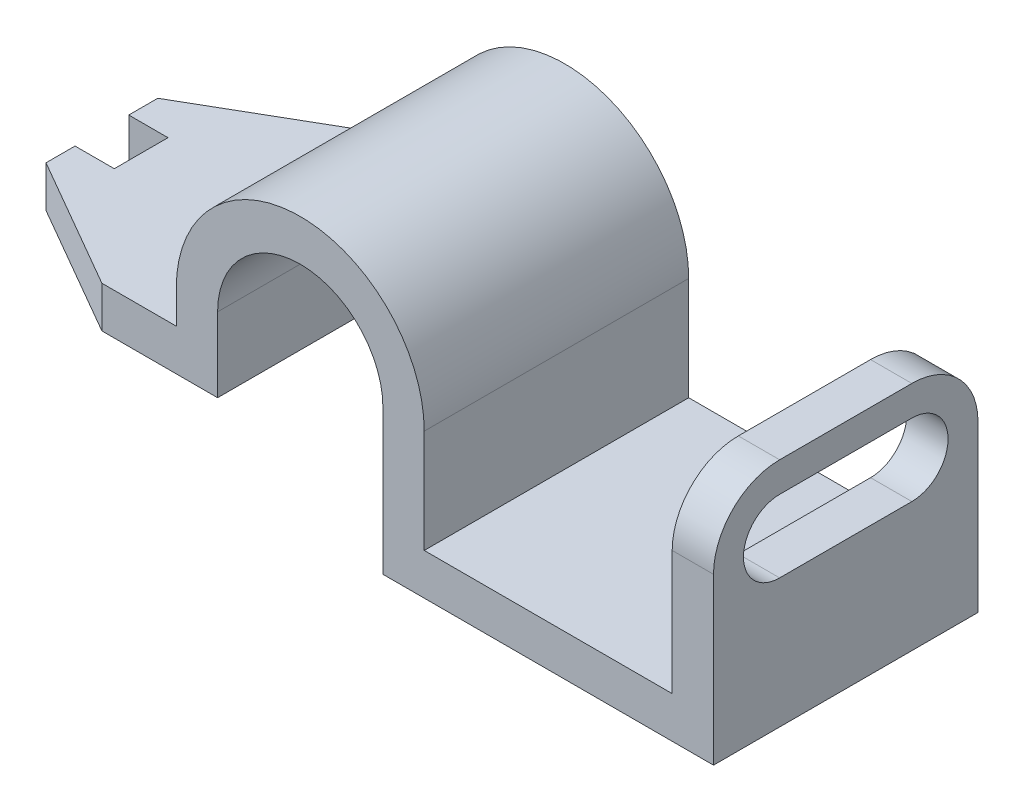
ISO-10303-21;
HEADER;
FILE_DESCRIPTION(('STEP AP214'),'2;1');
FILE_NAME('part.step','',(''),(''),'','','');
FILE_SCHEMA(('AUTOMOTIVE_DESIGN { 1 0 10303 214 1 1 1 1 }'));
ENDSEC;
DATA;
#1=APPLICATION_CONTEXT('core data for automotive mechanical design processes');
#2=APPLICATION_PROTOCOL_DEFINITION('international standard','automotive_design',2000,#1);
#3=PRODUCT_CONTEXT('',#1,'mechanical');
#4=PRODUCT('Part','Part','',(#3));
#5=PRODUCT_RELATED_PRODUCT_CATEGORY('part','',(#4));
#6=PRODUCT_DEFINITION_FORMATION('','',#4);
#7=PRODUCT_DEFINITION_CONTEXT('part definition',#1,'design');
#8=PRODUCT_DEFINITION('design','',#6,#7);
#9=PRODUCT_DEFINITION_SHAPE('','',#8);
#10=(LENGTH_UNIT() NAMED_UNIT(*) SI_UNIT(.MILLI.,.METRE.));
#11=(NAMED_UNIT(*) PLANE_ANGLE_UNIT() SI_UNIT($,.RADIAN.));
#12=(NAMED_UNIT(*) SI_UNIT($,.STERADIAN.) SOLID_ANGLE_UNIT());
#13=UNCERTAINTY_MEASURE_WITH_UNIT(LENGTH_MEASURE(1.E-05),#10,'distance_accuracy_value','');
#14=(GEOMETRIC_REPRESENTATION_CONTEXT(3) GLOBAL_UNCERTAINTY_ASSIGNED_CONTEXT((#13)) GLOBAL_UNIT_ASSIGNED_CONTEXT((#10,
#11,#12)) REPRESENTATION_CONTEXT('',''));
#15=CARTESIAN_POINT('',(0.,0.,0.));
#16=DIRECTION('',(0.,0.,1.));
#17=DIRECTION('',(1.,0.,0.));
#18=AXIS2_PLACEMENT_3D('',#15,#16,#17);
#19=CARTESIAN_POINT('',(-100.,27.,32.));
#20=DIRECTION('',(1.,0.,0.));
#21=DIRECTION('',(0.,0.,-1.));
#22=AXIS2_PLACEMENT_3D('',#19,#20,#21);
#23=PLANE('',#22);
#24=DIRECTION('',(0.,0.,-1.));
#25=VECTOR('',#24,1.);
#26=CARTESIAN_POINT('',(-100.,27.,32.));
#27=LINE('',#26,#25);
#28=CARTESIAN_POINT('',(-100.,27.,-6.5));
#29=VERTEX_POINT('',#28);
#30=CARTESIAN_POINT('',(-100.,27.,-13.5247913859322));
#31=VERTEX_POINT('',#30);
#32=EDGE_CURVE('E384',#29,#31,#27,.T.);
#33=ORIENTED_EDGE('',*,*,#32,.T.);
#34=DIRECTION('',(0.,1.,0.));
#35=VECTOR('',#34,1.);
#36=CARTESIAN_POINT('',(-100.,-0.001000000000001,-13.5247913859322));
#37=LINE('',#36,#35);
#38=CARTESIAN_POINT('',(-100.,17.,-13.5247913859322));
#39=VERTEX_POINT('',#38);
#40=EDGE_CURVE('E255',#39,#31,#37,.T.);
#41=ORIENTED_EDGE('',*,*,#40,.F.);
#42=DIRECTION('',(0.,0.,-1.));
#43=VECTOR('',#42,1.);
#44=CARTESIAN_POINT('',(-100.,17.,32.));
#45=LINE('',#44,#43);
#46=CARTESIAN_POINT('',(-100.,17.,-6.5));
#47=VERTEX_POINT('',#46);
#48=EDGE_CURVE('E380',#47,#39,#45,.T.);
#49=ORIENTED_EDGE('',*,*,#48,.F.);
#50=DIRECTION('',(0.,1.,0.));
#51=VECTOR('',#50,1.);
#52=CARTESIAN_POINT('',(-100.,-0.001000000000001,-6.5));
#53=LINE('',#52,#51);
#54=EDGE_CURVE('E266',#47,#29,#53,.T.);
#55=ORIENTED_EDGE('',*,*,#54,.T.);
#56=EDGE_LOOP('',(#33,#41,#49,#55));
#57=FACE_BOUND('',#56,.T.);
#58=ADVANCED_FACE('F41',(#57),#23,.F.);
#59=CARTESIAN_POINT('',(-100.,27.,32.));
#60=DIRECTION('',(0.,-1.,0.));
#61=DIRECTION('',(0.,0.,-1.));
#62=AXIS2_PLACEMENT_3D('',#59,#60,#61);
#63=PLANE('',#62);
#64=DIRECTION('',(-1.,0.,0.));
#65=VECTOR('',#64,1.);
#66=CARTESIAN_POINT('',(-100.,27.,-32.));
#67=LINE('',#66,#65);
#68=CARTESIAN_POINT('',(-50.,27.,-32.));
#69=VERTEX_POINT('',#68);
#70=CARTESIAN_POINT('',(-68.,27.,-32.));
#71=VERTEX_POINT('',#70);
#72=EDGE_CURVE('E263',#69,#71,#67,.T.);
#73=ORIENTED_EDGE('',*,*,#72,.T.);
#74=DIRECTION('',(0.866025403784442,0.,-0.499999999999995));
#75=VECTOR('',#74,1.);
#76=CARTESIAN_POINT('',(-100.,27.,-13.5247913859322));
#77=LINE('',#76,#75);
#78=EDGE_CURVE('E253',#31,#71,#77,.T.);
#79=ORIENTED_EDGE('',*,*,#78,.F.);
#80=ORIENTED_EDGE('',*,*,#32,.F.);
#81=DIRECTION('',(-1.,0.,0.));
#82=VECTOR('',#81,1.);
#83=CARTESIAN_POINT('',(-100.,27.,-6.5));
#84=LINE('',#83,#82);
#85=CARTESIAN_POINT('',(-90.5,27.,-6.5));
#86=VERTEX_POINT('',#85);
#87=EDGE_CURVE('E270',#86,#29,#84,.T.);
#88=ORIENTED_EDGE('',*,*,#87,.F.);
#89=DIRECTION('',(0.,0.,-1.));
#90=VECTOR('',#89,1.);
#91=CARTESIAN_POINT('',(-90.5,27.,-6.5));
#92=LINE('',#91,#90);
#93=CARTESIAN_POINT('',(-90.5,27.,6.5));
#94=VERTEX_POINT('',#93);
#95=EDGE_CURVE('E278',#94,#86,#92,.T.);
#96=ORIENTED_EDGE('',*,*,#95,.F.);
#97=DIRECTION('',(1.,0.,0.));
#98=VECTOR('',#97,1.);
#99=CARTESIAN_POINT('',(-100.,27.,6.5));
#100=LINE('',#99,#98);
#101=CARTESIAN_POINT('',(-100.,27.,6.5));
#102=VERTEX_POINT('',#101);
#103=EDGE_CURVE('E281',#102,#94,#100,.T.);
#104=ORIENTED_EDGE('',*,*,#103,.F.);
#105=CARTESIAN_POINT('',(-100.,27.,13.5247913859322));
#106=VERTEX_POINT('',#105);
#107=EDGE_CURVE('E387',#106,#102,#27,.T.);
#108=ORIENTED_EDGE('',*,*,#107,.F.);
#109=DIRECTION('',(-0.866025403784441,0.,-0.499999999999995));
#110=VECTOR('',#109,1.);
#111=CARTESIAN_POINT('',(-100.,27.,13.5247913859322));
#112=LINE('',#111,#110);
#113=CARTESIAN_POINT('',(-68.,27.,32.));
#114=VERTEX_POINT('',#113);
#115=EDGE_CURVE('E291',#114,#106,#112,.T.);
#116=ORIENTED_EDGE('',*,*,#115,.F.);
#117=DIRECTION('',(-1.,0.,0.));
#118=VECTOR('',#117,1.);
#119=CARTESIAN_POINT('',(-100.,27.,32.));
#120=LINE('',#119,#118);
#121=CARTESIAN_POINT('',(-50.,27.,32.));
#122=VERTEX_POINT('',#121);
#123=EDGE_CURVE('E295',#122,#114,#120,.T.);
#124=ORIENTED_EDGE('',*,*,#123,.F.);
#125=DIRECTION('',(0.,0.,-1.));
#126=VECTOR('',#125,1.);
#127=CARTESIAN_POINT('',(-50.,27.,32.));
#128=LINE('',#127,#126);
#129=EDGE_CURVE('E321',#122,#69,#128,.T.);
#130=ORIENTED_EDGE('',*,*,#129,.T.);
#131=EDGE_LOOP('',(#73,#79,#80,#88,#96,#104,#108,#116,#124,#130));
#132=FACE_BOUND('',#131,.T.);
#133=ADVANCED_FACE('F433',(#132),#63,.F.);
#134=ORIENTED_EDGE('',*,*,#107,.T.);
#135=DIRECTION('',(0.,1.,0.));
#136=VECTOR('',#135,1.);
#137=CARTESIAN_POINT('',(-100.,-0.001000000000001,6.5));
#138=LINE('',#137,#136);
#139=CARTESIAN_POINT('',(-100.,17.,6.5));
#140=VERTEX_POINT('',#139);
#141=EDGE_CURVE('E268',#140,#102,#138,.T.);
#142=ORIENTED_EDGE('',*,*,#141,.F.);
#143=CARTESIAN_POINT('',(-100.,17.,13.5247913859322));
#144=VERTEX_POINT('',#143);
#145=EDGE_CURVE('E383',#144,#140,#45,.T.);
#146=ORIENTED_EDGE('',*,*,#145,.F.);
#147=DIRECTION('',(0.,1.,0.));
#148=VECTOR('',#147,1.);
#149=CARTESIAN_POINT('',(-100.,-0.001000000000001,13.5247913859322));
#150=LINE('',#149,#148);
#151=EDGE_CURVE('E288',#144,#106,#150,.T.);
#152=ORIENTED_EDGE('',*,*,#151,.T.);
#153=EDGE_LOOP('',(#134,#142,#146,#152));
#154=FACE_BOUND('',#153,.T.);
#155=ADVANCED_FACE('F436',(#154),#23,.F.);
#156=CARTESIAN_POINT('',(-100.,17.,32.));
#157=DIRECTION('',(0.,1.,0.));
#158=DIRECTION('',(0.,0.,1.));
#159=AXIS2_PLACEMENT_3D('',#156,#157,#158);
#160=PLANE('',#159);
#161=ORIENTED_EDGE('',*,*,#48,.T.);
#162=DIRECTION('',(-0.866025403784442,0.,0.499999999999995));
#163=VECTOR('',#162,1.);
#164=CARTESIAN_POINT('',(-100.,17.,-13.5247913859322));
#165=LINE('',#164,#163);
#166=CARTESIAN_POINT('',(-68.,17.,-32.));
#167=VERTEX_POINT('',#166);
#168=EDGE_CURVE('E260',#167,#39,#165,.T.);
#169=ORIENTED_EDGE('',*,*,#168,.F.);
#170=DIRECTION('',(1.,0.,0.));
#171=VECTOR('',#170,1.);
#172=CARTESIAN_POINT('',(-100.,17.,-32.));
#173=LINE('',#172,#171);
#174=CARTESIAN_POINT('',(-40.,17.,-32.));
#175=VERTEX_POINT('',#174);
#176=EDGE_CURVE('E324',#167,#175,#173,.T.);
#177=ORIENTED_EDGE('',*,*,#176,.T.);
#178=DIRECTION('',(0.,0.,-1.));
#179=VECTOR('',#178,1.);
#180=CARTESIAN_POINT('',(-40.,17.,32.));
#181=LINE('',#180,#179);
#182=CARTESIAN_POINT('',(-40.,17.,32.));
#183=VERTEX_POINT('',#182);
#184=EDGE_CURVE('E377',#183,#175,#181,.T.);
#185=ORIENTED_EDGE('',*,*,#184,.F.);
#186=DIRECTION('',(1.,0.,0.));
#187=VECTOR('',#186,1.);
#188=CARTESIAN_POINT('',(-100.,17.,32.));
#189=LINE('',#188,#187);
#190=CARTESIAN_POINT('',(-68.0000000000001,17.,32.));
#191=VERTEX_POINT('',#190);
#192=EDGE_CURVE('E298',#191,#183,#189,.T.);
#193=ORIENTED_EDGE('',*,*,#192,.F.);
#194=DIRECTION('',(0.866025403784441,0.,0.499999999999995));
#195=VECTOR('',#194,1.);
#196=CARTESIAN_POINT('',(-100.,17.,13.5247913859322));
#197=LINE('',#196,#195);
#198=EDGE_CURVE('E267',#144,#191,#197,.T.);
#199=ORIENTED_EDGE('',*,*,#198,.F.);
#200=ORIENTED_EDGE('',*,*,#145,.T.);
#201=DIRECTION('',(-1.,0.,0.));
#202=VECTOR('',#201,1.);
#203=CARTESIAN_POINT('',(-100.,17.,6.5));
#204=LINE('',#203,#202);
#205=CARTESIAN_POINT('',(-90.5,17.,6.5));
#206=VERTEX_POINT('',#205);
#207=EDGE_CURVE('E264',#206,#140,#204,.T.);
#208=ORIENTED_EDGE('',*,*,#207,.F.);
#209=DIRECTION('',(0.,0.,1.));
#210=VECTOR('',#209,1.);
#211=CARTESIAN_POINT('',(-90.5,17.,-6.5));
#212=LINE('',#211,#210);
#213=CARTESIAN_POINT('',(-90.5,17.,-6.5));
#214=VERTEX_POINT('',#213);
#215=EDGE_CURVE('E256',#214,#206,#212,.T.);
#216=ORIENTED_EDGE('',*,*,#215,.F.);
#217=DIRECTION('',(1.,0.,0.));
#218=VECTOR('',#217,1.);
#219=CARTESIAN_POINT('',(-100.,17.,-6.5));
#220=LINE('',#219,#218);
#221=EDGE_CURVE('E284',#47,#214,#220,.T.);
#222=ORIENTED_EDGE('',*,*,#221,.F.);
#223=EDGE_LOOP('',(#161,#169,#177,#185,#193,#199,#200,#208,#216,#222));
#224=FACE_BOUND('',#223,.T.);
#225=ADVANCED_FACE('F444',(#224),#160,.F.);
#226=CARTESIAN_POINT('',(-40.,17.,32.));
#227=DIRECTION('',(-1.,0.,0.));
#228=DIRECTION('',(0.,-1.,0.));
#229=AXIS2_PLACEMENT_3D('',#226,#227,#228);
#230=PLANE('',#229);
#231=DIRECTION('',(0.,1.,0.));
#232=VECTOR('',#231,1.);
#233=CARTESIAN_POINT('',(-40.,17.,-32.));
#234=LINE('',#233,#232);
#235=CARTESIAN_POINT('',(-40.,35.,-32.));
#236=VERTEX_POINT('',#235);
#237=EDGE_CURVE('E326',#175,#236,#234,.T.);
#238=ORIENTED_EDGE('',*,*,#237,.T.);
#239=DIRECTION('',(0.,0.,-1.));
#240=VECTOR('',#239,1.);
#241=CARTESIAN_POINT('',(-40.,35.,32.));
#242=LINE('',#241,#240);
#243=CARTESIAN_POINT('',(-40.,35.,32.));
#244=VERTEX_POINT('',#243);
#245=EDGE_CURVE('E374',#244,#236,#242,.T.);
#246=ORIENTED_EDGE('',*,*,#245,.F.);
#247=DIRECTION('',(0.,1.,0.));
#248=VECTOR('',#247,1.);
#249=CARTESIAN_POINT('',(-40.,17.,32.));
#250=LINE('',#249,#248);
#251=EDGE_CURVE('E301',#183,#244,#250,.T.);
#252=ORIENTED_EDGE('',*,*,#251,.F.);
#253=ORIENTED_EDGE('',*,*,#184,.T.);
#254=EDGE_LOOP('',(#238,#246,#252,#253));
#255=FACE_BOUND('',#254,.T.);
#256=ADVANCED_FACE('F449',(#255),#230,.F.);
#257=CARTESIAN_POINT('',(-20.,35.,32.));
#258=DIRECTION('',(0.,0.,-1.));
#259=DIRECTION('',(-1.,0.,0.));
#260=AXIS2_PLACEMENT_3D('',#257,#258,#259);
#261=CYLINDRICAL_SURFACE('',#260,20.);
#262=CARTESIAN_POINT('',(-20.,35.,-32.));
#263=DIRECTION('',(0.,0.,-1.));
#264=DIRECTION('',(-1.,0.,0.));
#265=AXIS2_PLACEMENT_3D('',#262,#263,#264);
#266=CIRCLE('',#265,20.);
#267=CARTESIAN_POINT('',(0.,35.,-32.));
#268=VERTEX_POINT('',#267);
#269=EDGE_CURVE('E328',#236,#268,#266,.T.);
#270=ORIENTED_EDGE('',*,*,#269,.T.);
#271=DIRECTION('',(0.,0.,-1.));
#272=VECTOR('',#271,1.);
#273=CARTESIAN_POINT('',(0.,35.,32.));
#274=LINE('',#273,#272);
#275=CARTESIAN_POINT('',(0.,35.,32.));
#276=VERTEX_POINT('',#275);
#277=EDGE_CURVE('E371',#276,#268,#274,.T.);
#278=ORIENTED_EDGE('',*,*,#277,.F.);
#279=CARTESIAN_POINT('',(-20.,35.,32.));
#280=DIRECTION('',(0.,0.,-1.));
#281=DIRECTION('',(-1.,0.,0.));
#282=AXIS2_PLACEMENT_3D('',#279,#280,#281);
#283=CIRCLE('',#282,20.);
#284=EDGE_CURVE('E303',#244,#276,#283,.T.);
#285=ORIENTED_EDGE('',*,*,#284,.F.);
#286=ORIENTED_EDGE('',*,*,#245,.T.);
#287=EDGE_LOOP('',(#270,#278,#285,#286));
#288=FACE_BOUND('',#287,.T.);
#289=ADVANCED_FACE('F532',(#288),#261,.F.);
#290=CARTESIAN_POINT('',(0.,35.,32.));
#291=DIRECTION('',(1.,0.,0.));
#292=DIRECTION('',(0.,0.,-1.));
#293=AXIS2_PLACEMENT_3D('',#290,#291,#292);
#294=PLANE('',#293);
#295=DIRECTION('',(0.,-1.,0.));
#296=VECTOR('',#295,1.);
#297=CARTESIAN_POINT('',(0.,35.,-32.));
#298=LINE('',#297,#296);
#299=CARTESIAN_POINT('',(0.,0.,-32.));
#300=VERTEX_POINT('',#299);
#301=EDGE_CURVE('E330',#268,#300,#298,.T.);
#302=ORIENTED_EDGE('',*,*,#301,.T.);
#303=DIRECTION('',(0.,0.,-1.));
#304=VECTOR('',#303,1.);
#305=CARTESIAN_POINT('',(0.,0.,32.));
#306=LINE('',#305,#304);
#307=CARTESIAN_POINT('',(0.,0.,32.));
#308=VERTEX_POINT('',#307);
#309=EDGE_CURVE('E368',#308,#300,#306,.T.);
#310=ORIENTED_EDGE('',*,*,#309,.F.);
#311=DIRECTION('',(0.,-1.,0.));
#312=VECTOR('',#311,1.);
#313=CARTESIAN_POINT('',(0.,35.,32.));
#314=LINE('',#313,#312);
#315=EDGE_CURVE('E305',#276,#308,#314,.T.);
#316=ORIENTED_EDGE('',*,*,#315,.F.);
#317=ORIENTED_EDGE('',*,*,#277,.T.);
#318=EDGE_LOOP('',(#302,#310,#316,#317));
#319=FACE_BOUND('',#318,.T.);
#320=ADVANCED_FACE('F528',(#319),#294,.F.);
#321=CARTESIAN_POINT('',(0.,0.,32.));
#322=DIRECTION('',(0.,1.,0.));
#323=DIRECTION('',(0.,0.,1.));
#324=AXIS2_PLACEMENT_3D('',#321,#322,#323);
#325=PLANE('',#324);
#326=DIRECTION('',(1.,0.,0.));
#327=VECTOR('',#326,1.);
#328=CARTESIAN_POINT('',(0.,0.,-32.));
#329=LINE('',#328,#327);
#330=CARTESIAN_POINT('',(80.,0.,-32.));
#331=VERTEX_POINT('',#330);
#332=EDGE_CURVE('E332',#300,#331,#329,.T.);
#333=ORIENTED_EDGE('',*,*,#332,.T.);
#334=DIRECTION('',(0.,0.,-1.));
#335=VECTOR('',#334,1.);
#336=CARTESIAN_POINT('',(80.,0.,32.));
#337=LINE('',#336,#335);
#338=CARTESIAN_POINT('',(80.,0.,32.));
#339=VERTEX_POINT('',#338);
#340=EDGE_CURVE('E365',#339,#331,#337,.T.);
#341=ORIENTED_EDGE('',*,*,#340,.F.);
#342=DIRECTION('',(1.,0.,0.));
#343=VECTOR('',#342,1.);
#344=CARTESIAN_POINT('',(0.,0.,32.));
#345=LINE('',#344,#343);
#346=EDGE_CURVE('E307',#308,#339,#345,.T.);
#347=ORIENTED_EDGE('',*,*,#346,.F.);
#348=ORIENTED_EDGE('',*,*,#309,.T.);
#349=EDGE_LOOP('',(#333,#341,#347,#348));
#350=FACE_BOUND('',#349,.T.);
#351=ADVANCED_FACE('F524',(#350),#325,.F.);
#352=CARTESIAN_POINT('',(80.,0.,32.));
#353=DIRECTION('',(-1.,0.,0.));
#354=DIRECTION('',(0.,0.,1.));
#355=AXIS2_PLACEMENT_3D('',#352,#353,#354);
#356=PLANE('',#355);
#357=DIRECTION('',(0.,0.,-1.));
#358=VECTOR('',#357,1.);
#359=CARTESIAN_POINT('',(80.,31.25,16.));
#360=LINE('',#359,#358);
#361=CARTESIAN_POINT('',(80.,31.25,16.));
#362=VERTEX_POINT('',#361);
#363=CARTESIAN_POINT('',(80.,31.25,-16.));
#364=VERTEX_POINT('',#363);
#365=EDGE_CURVE('E787',#362,#364,#360,.T.);
#366=ORIENTED_EDGE('',*,*,#365,.F.);
#367=CARTESIAN_POINT('',(80.,40.,16.));
#368=DIRECTION('',(1.,0.,0.));
#369=DIRECTION('',(0.,0.,-1.));
#370=AXIS2_PLACEMENT_3D('',#367,#368,#369);
#371=CIRCLE('',#370,8.74999999999999);
#372=CARTESIAN_POINT('',(80.,48.75,16.));
#373=VERTEX_POINT('',#372);
#374=EDGE_CURVE('E252',#373,#362,#371,.T.);
#375=ORIENTED_EDGE('',*,*,#374,.F.);
#376=DIRECTION('',(0.,0.,1.));
#377=VECTOR('',#376,1.);
#378=CARTESIAN_POINT('',(80.,48.75,16.));
#379=LINE('',#378,#377);
#380=CARTESIAN_POINT('',(80.,48.75,-16.));
#381=VERTEX_POINT('',#380);
#382=EDGE_CURVE('E225',#381,#373,#379,.T.);
#383=ORIENTED_EDGE('',*,*,#382,.F.);
#384=CARTESIAN_POINT('',(80.,40.,-16.));
#385=DIRECTION('',(1.,0.,0.));
#386=DIRECTION('',(0.,0.,-1.));
#387=AXIS2_PLACEMENT_3D('',#384,#385,#386);
#388=CIRCLE('',#387,8.74999999999999);
#389=EDGE_CURVE('E782',#364,#381,#388,.T.);
#390=ORIENTED_EDGE('',*,*,#389,.F.);
#391=EDGE_LOOP('',(#366,#375,#383,#390));
#392=FACE_BOUND('',#391,.T.);
#393=DIRECTION('',(0.,1.,0.));
#394=VECTOR('',#393,1.);
#395=CARTESIAN_POINT('',(80.,0.,-32.));
#396=LINE('',#395,#394);
#397=CARTESIAN_POINT('',(80.,40.,-32.));
#398=VERTEX_POINT('',#397);
#399=EDGE_CURVE('E334',#331,#398,#396,.T.);
#400=ORIENTED_EDGE('',*,*,#399,.T.);
#401=CARTESIAN_POINT('',(80.,40.,-16.));
#402=DIRECTION('',(-1.,0.,0.));
#403=DIRECTION('',(0.,0.,1.));
#404=AXIS2_PLACEMENT_3D('',#401,#402,#403);
#405=CIRCLE('',#404,16.);
#406=CARTESIAN_POINT('',(80.,56.,-16.));
#407=VERTEX_POINT('',#406);
#408=EDGE_CURVE('E49',#398,#407,#405,.F.);
#409=ORIENTED_EDGE('',*,*,#408,.T.);
#410=DIRECTION('',(0.,0.,-1.));
#411=VECTOR('',#410,1.);
#412=CARTESIAN_POINT('',(80.,56.,32.));
#413=LINE('',#412,#411);
#414=CARTESIAN_POINT('',(80.,56.,16.));
#415=VERTEX_POINT('',#414);
#416=EDGE_CURVE('E362',#415,#407,#413,.T.);
#417=ORIENTED_EDGE('',*,*,#416,.F.);
#418=CARTESIAN_POINT('',(80.,40.,16.));
#419=DIRECTION('',(-1.,0.,0.));
#420=DIRECTION('',(0.,0.,1.));
#421=AXIS2_PLACEMENT_3D('',#418,#419,#420);
#422=CIRCLE('',#421,16.);
#423=CARTESIAN_POINT('',(80.,40.,32.));
#424=VERTEX_POINT('',#423);
#425=EDGE_CURVE('E56',#415,#424,#422,.F.);
#426=ORIENTED_EDGE('',*,*,#425,.T.);
#427=DIRECTION('',(0.,1.,0.));
#428=VECTOR('',#427,1.);
#429=CARTESIAN_POINT('',(80.,0.,32.));
#430=LINE('',#429,#428);
#431=EDGE_CURVE('E309',#339,#424,#430,.T.);
#432=ORIENTED_EDGE('',*,*,#431,.F.);
#433=ORIENTED_EDGE('',*,*,#340,.T.);
#434=EDGE_LOOP('',(#400,#409,#417,#426,#432,#433));
#435=FACE_BOUND('',#434,.T.);
#436=ADVANCED_FACE('F399',(#392,#435),#356,.F.);
#437=CARTESIAN_POINT('',(80.,56.,32.));
#438=DIRECTION('',(0.,-1.,0.));
#439=DIRECTION('',(0.,0.,-1.));
#440=AXIS2_PLACEMENT_3D('',#437,#438,#439);
#441=PLANE('',#440);
#442=ORIENTED_EDGE('',*,*,#416,.T.);
#443=DIRECTION('',(-1.,0.,0.));
#444=VECTOR('',#443,1.);
#445=CARTESIAN_POINT('',(70.,56.,-16.));
#446=LINE('',#445,#444);
#447=CARTESIAN_POINT('',(70.,56.,-16.));
#448=VERTEX_POINT('',#447);
#449=EDGE_CURVE('E390',#407,#448,#446,.T.);
#450=ORIENTED_EDGE('',*,*,#449,.T.);
#451=DIRECTION('',(0.,0.,-1.));
#452=VECTOR('',#451,1.);
#453=CARTESIAN_POINT('',(70.,56.,32.));
#454=LINE('',#453,#452);
#455=CARTESIAN_POINT('',(70.,56.,16.));
#456=VERTEX_POINT('',#455);
#457=EDGE_CURVE('E359',#456,#448,#454,.T.);
#458=ORIENTED_EDGE('',*,*,#457,.F.);
#459=DIRECTION('',(-1.,0.,0.));
#460=VECTOR('',#459,1.);
#461=CARTESIAN_POINT('',(80.,56.,16.));
#462=LINE('',#461,#460);
#463=EDGE_CURVE('E388',#456,#415,#462,.F.);
#464=ORIENTED_EDGE('',*,*,#463,.T.);
#465=EDGE_LOOP('',(#442,#450,#458,#464));
#466=FACE_BOUND('',#465,.T.);
#467=ADVANCED_FACE('F403',(#466),#441,.F.);
#468=CARTESIAN_POINT('',(70.,56.,32.));
#469=DIRECTION('',(1.,0.,0.));
#470=DIRECTION('',(0.,1.,0.));
#471=AXIS2_PLACEMENT_3D('',#468,#469,#470);
#472=PLANE('',#471);
#473=DIRECTION('',(0.,0.,-1.));
#474=VECTOR('',#473,1.);
#475=CARTESIAN_POINT('',(70.,48.75,16.));
#476=LINE('',#475,#474);
#477=CARTESIAN_POINT('',(70.,48.75,16.));
#478=VERTEX_POINT('',#477);
#479=CARTESIAN_POINT('',(70.,48.75,-16.));
#480=VERTEX_POINT('',#479);
#481=EDGE_CURVE('E222',#478,#480,#476,.T.);
#482=ORIENTED_EDGE('',*,*,#481,.F.);
#483=CARTESIAN_POINT('',(70.,40.,16.));
#484=DIRECTION('',(1.,0.,0.));
#485=DIRECTION('',(0.,1.,0.));
#486=AXIS2_PLACEMENT_3D('',#483,#484,#485);
#487=CIRCLE('',#486,8.74999999999999);
#488=CARTESIAN_POINT('',(70.,31.25,16.));
#489=VERTEX_POINT('',#488);
#490=EDGE_CURVE('E232',#489,#478,#487,.F.);
#491=ORIENTED_EDGE('',*,*,#490,.F.);
#492=DIRECTION('',(0.,0.,1.));
#493=VECTOR('',#492,1.);
#494=CARTESIAN_POINT('',(70.,31.25,16.));
#495=LINE('',#494,#493);
#496=CARTESIAN_POINT('',(70.,31.25,-16.));
#497=VERTEX_POINT('',#496);
#498=EDGE_CURVE('E238',#497,#489,#495,.T.);
#499=ORIENTED_EDGE('',*,*,#498,.F.);
#500=CARTESIAN_POINT('',(70.,40.,-16.));
#501=DIRECTION('',(1.,0.,0.));
#502=DIRECTION('',(0.,1.,0.));
#503=AXIS2_PLACEMENT_3D('',#500,#501,#502);
#504=CIRCLE('',#503,8.74999999999999);
#505=EDGE_CURVE('E242',#480,#497,#504,.F.);
#506=ORIENTED_EDGE('',*,*,#505,.F.);
#507=EDGE_LOOP('',(#482,#491,#499,#506));
#508=FACE_BOUND('',#507,.T.);
#509=ORIENTED_EDGE('',*,*,#457,.T.);
#510=CARTESIAN_POINT('',(70.,40.,-16.));
#511=DIRECTION('',(1.,0.,0.));
#512=DIRECTION('',(0.,1.,0.));
#513=AXIS2_PLACEMENT_3D('',#510,#511,#512);
#514=CIRCLE('',#513,16.);
#515=CARTESIAN_POINT('',(70.,40.,-32.));
#516=VERTEX_POINT('',#515);
#517=EDGE_CURVE('E395',#448,#516,#514,.F.);
#518=ORIENTED_EDGE('',*,*,#517,.T.);
#519=DIRECTION('',(0.,-1.,0.));
#520=VECTOR('',#519,1.);
#521=CARTESIAN_POINT('',(70.,56.,-32.));
#522=LINE('',#521,#520);
#523=CARTESIAN_POINT('',(70.,9.99999999999999,-32.));
#524=VERTEX_POINT('',#523);
#525=EDGE_CURVE('E336',#516,#524,#522,.T.);
#526=ORIENTED_EDGE('',*,*,#525,.T.);
#527=DIRECTION('',(0.,0.,-1.));
#528=VECTOR('',#527,1.);
#529=CARTESIAN_POINT('',(70.,9.99999999999999,32.));
#530=LINE('',#529,#528);
#531=CARTESIAN_POINT('',(70.,9.99999999999999,32.));
#532=VERTEX_POINT('',#531);
#533=EDGE_CURVE('E356',#532,#524,#530,.T.);
#534=ORIENTED_EDGE('',*,*,#533,.F.);
#535=DIRECTION('',(0.,-1.,0.));
#536=VECTOR('',#535,1.);
#537=CARTESIAN_POINT('',(70.,56.,32.));
#538=LINE('',#537,#536);
#539=CARTESIAN_POINT('',(70.,40.,32.));
#540=VERTEX_POINT('',#539);
#541=EDGE_CURVE('E311',#540,#532,#538,.T.);
#542=ORIENTED_EDGE('',*,*,#541,.F.);
#543=CARTESIAN_POINT('',(70.,40.,16.));
#544=DIRECTION('',(1.,0.,0.));
#545=DIRECTION('',(0.,1.,0.));
#546=AXIS2_PLACEMENT_3D('',#543,#544,#545);
#547=CIRCLE('',#546,16.);
#548=EDGE_CURVE('E393',#540,#456,#547,.F.);
#549=ORIENTED_EDGE('',*,*,#548,.T.);
#550=EDGE_LOOP('',(#509,#518,#526,#534,#542,#549));
#551=FACE_BOUND('',#550,.T.);
#552=ADVANCED_FACE('F240',(#508,#551),#472,.F.);
#553=CARTESIAN_POINT('',(70.,9.99999999999999,32.));
#554=DIRECTION('',(0.,-1.,0.));
#555=DIRECTION('',(1.,0.,0.));
#556=AXIS2_PLACEMENT_3D('',#553,#554,#555);
#557=PLANE('',#556);
#558=DIRECTION('',(-1.,0.,0.));
#559=VECTOR('',#558,1.);
#560=CARTESIAN_POINT('',(70.,9.99999999999999,-32.));
#561=LINE('',#560,#559);
#562=CARTESIAN_POINT('',(10.,9.99999999999999,-32.));
#563=VERTEX_POINT('',#562);
#564=EDGE_CURVE('E338',#524,#563,#561,.T.);
#565=ORIENTED_EDGE('',*,*,#564,.T.);
#566=DIRECTION('',(0.,0.,-1.));
#567=VECTOR('',#566,1.);
#568=CARTESIAN_POINT('',(10.,9.99999999999999,32.));
#569=LINE('',#568,#567);
#570=CARTESIAN_POINT('',(10.,9.99999999999999,32.));
#571=VERTEX_POINT('',#570);
#572=EDGE_CURVE('E353',#571,#563,#569,.T.);
#573=ORIENTED_EDGE('',*,*,#572,.F.);
#574=DIRECTION('',(-1.,0.,0.));
#575=VECTOR('',#574,1.);
#576=CARTESIAN_POINT('',(70.,9.99999999999999,32.));
#577=LINE('',#576,#575);
#578=EDGE_CURVE('E313',#532,#571,#577,.T.);
#579=ORIENTED_EDGE('',*,*,#578,.F.);
#580=ORIENTED_EDGE('',*,*,#533,.T.);
#581=EDGE_LOOP('',(#565,#573,#579,#580));
#582=FACE_BOUND('',#581,.T.);
#583=ADVANCED_FACE('F414',(#582),#557,.F.);
#584=CARTESIAN_POINT('',(10.,9.99999999999999,32.));
#585=DIRECTION('',(-1.,0.,0.));
#586=DIRECTION('',(0.,-1.,0.));
#587=AXIS2_PLACEMENT_3D('',#584,#585,#586);
#588=PLANE('',#587);
#589=DIRECTION('',(0.,1.,0.));
#590=VECTOR('',#589,1.);
#591=CARTESIAN_POINT('',(10.,9.99999999999999,-32.));
#592=LINE('',#591,#590);
#593=CARTESIAN_POINT('',(9.99999999999999,35.,-32.));
#594=VERTEX_POINT('',#593);
#595=EDGE_CURVE('E340',#563,#594,#592,.T.);
#596=ORIENTED_EDGE('',*,*,#595,.T.);
#597=DIRECTION('',(0.,0.,-1.));
#598=VECTOR('',#597,1.);
#599=CARTESIAN_POINT('',(9.99999999999999,35.,32.));
#600=LINE('',#599,#598);
#601=CARTESIAN_POINT('',(9.99999999999999,35.,32.));
#602=VERTEX_POINT('',#601);
#603=EDGE_CURVE('E350',#602,#594,#600,.T.);
#604=ORIENTED_EDGE('',*,*,#603,.F.);
#605=DIRECTION('',(0.,1.,0.));
#606=VECTOR('',#605,1.);
#607=CARTESIAN_POINT('',(10.,9.99999999999999,32.));
#608=LINE('',#607,#606);
#609=EDGE_CURVE('E315',#571,#602,#608,.T.);
#610=ORIENTED_EDGE('',*,*,#609,.F.);
#611=ORIENTED_EDGE('',*,*,#572,.T.);
#612=EDGE_LOOP('',(#596,#604,#610,#611));
#613=FACE_BOUND('',#612,.T.);
#614=ADVANCED_FACE('F418',(#613),#588,.F.);
#615=CARTESIAN_POINT('',(-20.,35.,32.));
#616=DIRECTION('',(0.,0.,-1.));
#617=DIRECTION('',(-1.,0.,0.));
#618=AXIS2_PLACEMENT_3D('',#615,#616,#617);
#619=CYLINDRICAL_SURFACE('',#618,30.);
#620=CARTESIAN_POINT('',(-20.,35.,-32.));
#621=DIRECTION('',(0.,0.,1.));
#622=DIRECTION('',(-1.,0.,0.));
#623=AXIS2_PLACEMENT_3D('',#620,#621,#622);
#624=CIRCLE('',#623,30.);
#625=CARTESIAN_POINT('',(-50.,35.,-32.));
#626=VERTEX_POINT('',#625);
#627=EDGE_CURVE('E342',#594,#626,#624,.T.);
#628=ORIENTED_EDGE('',*,*,#627,.T.);
#629=DIRECTION('',(0.,0.,-1.));
#630=VECTOR('',#629,1.);
#631=CARTESIAN_POINT('',(-50.,35.,32.));
#632=LINE('',#631,#630);
#633=CARTESIAN_POINT('',(-50.,35.,32.));
#634=VERTEX_POINT('',#633);
#635=EDGE_CURVE('E347',#634,#626,#632,.T.);
#636=ORIENTED_EDGE('',*,*,#635,.F.);
#637=CARTESIAN_POINT('',(-20.,35.,32.));
#638=DIRECTION('',(0.,0.,1.));
#639=DIRECTION('',(-1.,0.,0.));
#640=AXIS2_PLACEMENT_3D('',#637,#638,#639);
#641=CIRCLE('',#640,30.);
#642=EDGE_CURVE('E317',#602,#634,#641,.T.);
#643=ORIENTED_EDGE('',*,*,#642,.F.);
#644=ORIENTED_EDGE('',*,*,#603,.T.);
#645=EDGE_LOOP('',(#628,#636,#643,#644));
#646=FACE_BOUND('',#645,.T.);
#647=ADVANCED_FACE('F510',(#646),#619,.T.);
#648=CARTESIAN_POINT('',(-50.,27.,32.));
#649=DIRECTION('',(1.,0.,0.));
#650=DIRECTION('',(0.,0.,-1.));
#651=AXIS2_PLACEMENT_3D('',#648,#649,#650);
#652=PLANE('',#651);
#653=DIRECTION('',(0.,-1.,0.));
#654=VECTOR('',#653,1.);
#655=CARTESIAN_POINT('',(-50.,27.,-32.));
#656=LINE('',#655,#654);
#657=EDGE_CURVE('E299',#626,#69,#656,.T.);
#658=ORIENTED_EDGE('',*,*,#657,.T.);
#659=ORIENTED_EDGE('',*,*,#129,.F.);
#660=DIRECTION('',(0.,-1.,0.));
#661=VECTOR('',#660,1.);
#662=CARTESIAN_POINT('',(-50.,27.,32.));
#663=LINE('',#662,#661);
#664=EDGE_CURVE('E319',#634,#122,#663,.T.);
#665=ORIENTED_EDGE('',*,*,#664,.F.);
#666=ORIENTED_EDGE('',*,*,#635,.T.);
#667=EDGE_LOOP('',(#658,#659,#665,#666));
#668=FACE_BOUND('',#667,.T.);
#669=ADVANCED_FACE('F505',(#668),#652,.F.);
#670=CARTESIAN_POINT('',(-20.,35.,32.));
#671=DIRECTION('',(0.,0.,-1.));
#672=DIRECTION('',(-1.,0.,0.));
#673=AXIS2_PLACEMENT_3D('',#670,#671,#672);
#674=PLANE('',#673);
#675=ORIENTED_EDGE('',*,*,#431,.T.);
#676=DIRECTION('',(-1.,0.,0.));
#677=VECTOR('',#676,1.);
#678=CARTESIAN_POINT('',(-20.,40.,32.));
#679=LINE('',#678,#677);
#680=EDGE_CURVE('E11',#424,#540,#679,.T.);
#681=ORIENTED_EDGE('',*,*,#680,.T.);
#682=ORIENTED_EDGE('',*,*,#541,.T.);
#683=ORIENTED_EDGE('',*,*,#578,.T.);
#684=ORIENTED_EDGE('',*,*,#609,.T.);
#685=ORIENTED_EDGE('',*,*,#642,.T.);
#686=ORIENTED_EDGE('',*,*,#664,.T.);
#687=ORIENTED_EDGE('',*,*,#123,.T.);
#688=DIRECTION('',(0.,1.,0.));
#689=VECTOR('',#688,1.);
#690=CARTESIAN_POINT('',(-68.,-0.001000000000001,32.));
#691=LINE('',#690,#689);
#692=EDGE_CURVE('E244',#191,#114,#691,.T.);
#693=ORIENTED_EDGE('',*,*,#692,.F.);
#694=ORIENTED_EDGE('',*,*,#192,.T.);
#695=ORIENTED_EDGE('',*,*,#251,.T.);
#696=ORIENTED_EDGE('',*,*,#284,.T.);
#697=ORIENTED_EDGE('',*,*,#315,.T.);
#698=ORIENTED_EDGE('',*,*,#346,.T.);
#699=EDGE_LOOP('',(#675,#681,#682,#683,#684,#685,#686,#687,#693,#694,#695,#696,#697,#698));
#700=FACE_BOUND('',#699,.T.);
#701=ADVANCED_FACE('F422',(#700),#674,.F.);
#702=CARTESIAN_POINT('',(-20.,35.,-32.));
#703=DIRECTION('',(0.,0.,-1.));
#704=DIRECTION('',(-1.,0.,0.));
#705=AXIS2_PLACEMENT_3D('',#702,#703,#704);
#706=PLANE('',#705);
#707=ORIENTED_EDGE('',*,*,#525,.F.);
#708=DIRECTION('',(-1.,0.,0.));
#709=VECTOR('',#708,1.);
#710=CARTESIAN_POINT('',(80.,40.,-32.));
#711=LINE('',#710,#709);
#712=EDGE_CURVE('E64',#516,#398,#711,.F.);
#713=ORIENTED_EDGE('',*,*,#712,.T.);
#714=ORIENTED_EDGE('',*,*,#399,.F.);
#715=ORIENTED_EDGE('',*,*,#332,.F.);
#716=ORIENTED_EDGE('',*,*,#301,.F.);
#717=ORIENTED_EDGE('',*,*,#269,.F.);
#718=ORIENTED_EDGE('',*,*,#237,.F.);
#719=ORIENTED_EDGE('',*,*,#176,.F.);
#720=DIRECTION('',(0.,1.,0.));
#721=VECTOR('',#720,1.);
#722=CARTESIAN_POINT('',(-68.,-0.001000000000001,-32.));
#723=LINE('',#722,#721);
#724=EDGE_CURVE('E257',#167,#71,#723,.T.);
#725=ORIENTED_EDGE('',*,*,#724,.T.);
#726=ORIENTED_EDGE('',*,*,#72,.F.);
#727=ORIENTED_EDGE('',*,*,#657,.F.);
#728=ORIENTED_EDGE('',*,*,#627,.F.);
#729=ORIENTED_EDGE('',*,*,#595,.F.);
#730=ORIENTED_EDGE('',*,*,#564,.F.);
#731=EDGE_LOOP('',(#707,#713,#714,#715,#716,#717,#718,#719,#725,#726,#727,#728,#729,#730));
#732=FACE_BOUND('',#731,.T.);
#733=ADVANCED_FACE('F409',(#732),#706,.T.);
#734=CARTESIAN_POINT('',(-100.,-0.001000000000001,-13.5247913859322));
#735=DIRECTION('',(0.499999999999995,0.,0.866025403784442));
#736=DIRECTION('',(0.866025403784442,0.,-0.499999999999995));
#737=AXIS2_PLACEMENT_3D('',#734,#735,#736);
#738=PLANE('',#737);
#739=ORIENTED_EDGE('',*,*,#168,.T.);
#740=ORIENTED_EDGE('',*,*,#40,.T.);
#741=ORIENTED_EDGE('',*,*,#78,.T.);
#742=ORIENTED_EDGE('',*,*,#724,.F.);
#743=EDGE_LOOP('',(#739,#740,#741,#742));
#744=FACE_BOUND('',#743,.T.);
#745=ADVANCED_FACE('F483',(#744),#738,.F.);
#746=CARTESIAN_POINT('',(-100.,-0.001000000000001,13.5247913859322));
#747=DIRECTION('',(0.499999999999995,0.,-0.866025403784441));
#748=DIRECTION('',(-0.866025403784441,0.,-0.499999999999995));
#749=AXIS2_PLACEMENT_3D('',#746,#747,#748);
#750=PLANE('',#749);
#751=ORIENTED_EDGE('',*,*,#198,.T.);
#752=ORIENTED_EDGE('',*,*,#692,.T.);
#753=ORIENTED_EDGE('',*,*,#115,.T.);
#754=ORIENTED_EDGE('',*,*,#151,.F.);
#755=EDGE_LOOP('',(#751,#752,#753,#754));
#756=FACE_BOUND('',#755,.T.);
#757=ADVANCED_FACE('F472',(#756),#750,.F.);
#758=CARTESIAN_POINT('',(-100.,-0.001000000000001,-6.5));
#759=DIRECTION('',(0.,0.,-1.));
#760=DIRECTION('',(-1.,0.,0.));
#761=AXIS2_PLACEMENT_3D('',#758,#759,#760);
#762=PLANE('',#761);
#763=ORIENTED_EDGE('',*,*,#221,.T.);
#764=DIRECTION('',(0.,1.,0.));
#765=VECTOR('',#764,1.);
#766=CARTESIAN_POINT('',(-90.5,-0.001000000000001,-6.5));
#767=LINE('',#766,#765);
#768=EDGE_CURVE('E273',#214,#86,#767,.T.);
#769=ORIENTED_EDGE('',*,*,#768,.T.);
#770=ORIENTED_EDGE('',*,*,#87,.T.);
#771=ORIENTED_EDGE('',*,*,#54,.F.);
#772=EDGE_LOOP('',(#763,#769,#770,#771));
#773=FACE_BOUND('',#772,.T.);
#774=ADVANCED_FACE('F488',(#773),#762,.F.);
#775=CARTESIAN_POINT('',(-90.5,-0.001000000000001,-6.5));
#776=DIRECTION('',(1.,0.,0.));
#777=DIRECTION('',(0.,0.,-1.));
#778=AXIS2_PLACEMENT_3D('',#775,#776,#777);
#779=PLANE('',#778);
#780=ORIENTED_EDGE('',*,*,#215,.T.);
#781=DIRECTION('',(0.,1.,0.));
#782=VECTOR('',#781,1.);
#783=CARTESIAN_POINT('',(-90.5,-0.001000000000001,6.5));
#784=LINE('',#783,#782);
#785=EDGE_CURVE('E271',#206,#94,#784,.T.);
#786=ORIENTED_EDGE('',*,*,#785,.T.);
#787=ORIENTED_EDGE('',*,*,#95,.T.);
#788=ORIENTED_EDGE('',*,*,#768,.F.);
#789=EDGE_LOOP('',(#780,#786,#787,#788));
#790=FACE_BOUND('',#789,.T.);
#791=ADVANCED_FACE('F490',(#790),#779,.F.);
#792=CARTESIAN_POINT('',(-100.,-0.001000000000001,6.5));
#793=DIRECTION('',(0.,0.,1.));
#794=DIRECTION('',(1.,0.,0.));
#795=AXIS2_PLACEMENT_3D('',#792,#793,#794);
#796=PLANE('',#795);
#797=ORIENTED_EDGE('',*,*,#207,.T.);
#798=ORIENTED_EDGE('',*,*,#141,.T.);
#799=ORIENTED_EDGE('',*,*,#103,.T.);
#800=ORIENTED_EDGE('',*,*,#785,.F.);
#801=EDGE_LOOP('',(#797,#798,#799,#800));
#802=FACE_BOUND('',#801,.T.);
#803=ADVANCED_FACE('F463',(#802),#796,.F.);
#804=CARTESIAN_POINT('',(-100.001,40.,16.));
#805=DIRECTION('',(1.,0.,0.));
#806=DIRECTION('',(0.,0.,-1.));
#807=AXIS2_PLACEMENT_3D('',#804,#805,#806);
#808=CYLINDRICAL_SURFACE('',#807,8.74999999999999);
#809=ORIENTED_EDGE('',*,*,#490,.T.);
#810=DIRECTION('',(1.,0.,0.));
#811=VECTOR('',#810,1.);
#812=CARTESIAN_POINT('',(-100.001,48.75,16.));
#813=LINE('',#812,#811);
#814=EDGE_CURVE('E218',#478,#373,#813,.T.);
#815=ORIENTED_EDGE('',*,*,#814,.T.);
#816=ORIENTED_EDGE('',*,*,#374,.T.);
#817=DIRECTION('',(1.,0.,0.));
#818=VECTOR('',#817,1.);
#819=CARTESIAN_POINT('',(-100.001,31.25,16.));
#820=LINE('',#819,#818);
#821=EDGE_CURVE('E229',#489,#362,#820,.T.);
#822=ORIENTED_EDGE('',*,*,#821,.F.);
#823=EDGE_LOOP('',(#809,#815,#816,#822));
#824=FACE_BOUND('',#823,.T.);
#825=ADVANCED_FACE('F233',(#824),#808,.F.);
#826=CARTESIAN_POINT('',(-100.001,48.75,16.));
#827=DIRECTION('',(0.,1.,0.));
#828=DIRECTION('',(0.,0.,1.));
#829=AXIS2_PLACEMENT_3D('',#826,#827,#828);
#830=PLANE('',#829);
#831=ORIENTED_EDGE('',*,*,#481,.T.);
#832=DIRECTION('',(1.,0.,0.));
#833=VECTOR('',#832,1.);
#834=CARTESIAN_POINT('',(-100.001,48.75,-16.));
#835=LINE('',#834,#833);
#836=EDGE_CURVE('E228',#480,#381,#835,.T.);
#837=ORIENTED_EDGE('',*,*,#836,.T.);
#838=ORIENTED_EDGE('',*,*,#382,.T.);
#839=ORIENTED_EDGE('',*,*,#814,.F.);
#840=EDGE_LOOP('',(#831,#837,#838,#839));
#841=FACE_BOUND('',#840,.T.);
#842=ADVANCED_FACE('F220',(#841),#830,.F.);
#843=CARTESIAN_POINT('',(-100.001,40.,-16.));
#844=DIRECTION('',(1.,0.,0.));
#845=DIRECTION('',(0.,0.,-1.));
#846=AXIS2_PLACEMENT_3D('',#843,#844,#845);
#847=CYLINDRICAL_SURFACE('',#846,8.74999999999999);
#848=ORIENTED_EDGE('',*,*,#505,.T.);
#849=DIRECTION('',(1.,0.,0.));
#850=VECTOR('',#849,1.);
#851=CARTESIAN_POINT('',(-100.001,31.25,-16.));
#852=LINE('',#851,#850);
#853=EDGE_CURVE('E250',#497,#364,#852,.T.);
#854=ORIENTED_EDGE('',*,*,#853,.T.);
#855=ORIENTED_EDGE('',*,*,#389,.T.);
#856=ORIENTED_EDGE('',*,*,#836,.F.);
#857=EDGE_LOOP('',(#848,#854,#855,#856));
#858=FACE_BOUND('',#857,.T.);
#859=ADVANCED_FACE('F648',(#858),#847,.F.);
#860=CARTESIAN_POINT('',(-100.001,31.25,16.));
#861=DIRECTION('',(0.,-1.,0.));
#862=DIRECTION('',(0.,0.,-1.));
#863=AXIS2_PLACEMENT_3D('',#860,#861,#862);
#864=PLANE('',#863);
#865=ORIENTED_EDGE('',*,*,#498,.T.);
#866=ORIENTED_EDGE('',*,*,#821,.T.);
#867=ORIENTED_EDGE('',*,*,#365,.T.);
#868=ORIENTED_EDGE('',*,*,#853,.F.);
#869=EDGE_LOOP('',(#865,#866,#867,#868));
#870=FACE_BOUND('',#869,.T.);
#871=ADVANCED_FACE('F431',(#870),#864,.F.);
#872=CARTESIAN_POINT('',(80.,40.,-16.));
#873=DIRECTION('',(1.,0.,0.));
#874=DIRECTION('',(0.,0.,-1.));
#875=AXIS2_PLACEMENT_3D('',#872,#873,#874);
#876=CYLINDRICAL_SURFACE('',#875,16.);
#877=ORIENTED_EDGE('',*,*,#408,.F.);
#878=ORIENTED_EDGE('',*,*,#712,.F.);
#879=ORIENTED_EDGE('',*,*,#517,.F.);
#880=ORIENTED_EDGE('',*,*,#449,.F.);
#881=EDGE_LOOP('',(#877,#878,#879,#880));
#882=FACE_BOUND('',#881,.T.);
#883=ADVANCED_FACE('F406',(#882),#876,.T.);
#884=CARTESIAN_POINT('',(-20.,40.,16.));
#885=DIRECTION('',(-1.,0.,0.));
#886=DIRECTION('',(0.,0.,1.));
#887=AXIS2_PLACEMENT_3D('',#884,#885,#886);
#888=CYLINDRICAL_SURFACE('',#887,16.);
#889=ORIENTED_EDGE('',*,*,#425,.F.);
#890=ORIENTED_EDGE('',*,*,#463,.F.);
#891=ORIENTED_EDGE('',*,*,#548,.F.);
#892=ORIENTED_EDGE('',*,*,#680,.F.);
#893=EDGE_LOOP('',(#889,#890,#891,#892));
#894=FACE_BOUND('',#893,.T.);
#895=ADVANCED_FACE('F43',(#894),#888,.T.);
#896=CLOSED_SHELL('',(#58,#133,#155,#225,#256,#289,#320,#351,#436,#467,#552,#583,#614,#647,#669,
#701,#733,#745,#757,#774,#791,#803,#825,#842,#859,#871,#883,#895));
#897=MANIFOLD_SOLID_BREP('B2',#896);
#898=ADVANCED_BREP_SHAPE_REPRESENTATION('',(#18,#897),#14);
#899=SHAPE_DEFINITION_REPRESENTATION(#9,#898);
ENDSEC;
END-ISO-10303-21;
